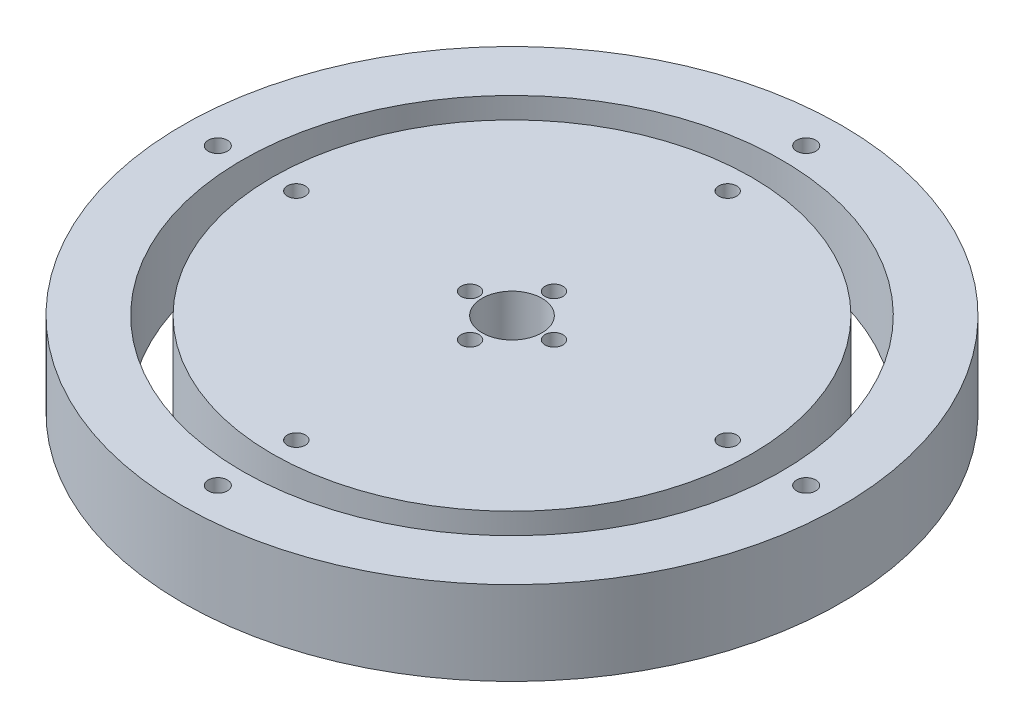
ISO-10303-21;
HEADER;
FILE_DESCRIPTION(('STEP AP214'),'2;1');
FILE_NAME('part.step','',(''),(''),'','','');
FILE_SCHEMA(('AUTOMOTIVE_DESIGN { 1 0 10303 214 1 1 1 1 }'));
ENDSEC;
DATA;
#1=APPLICATION_CONTEXT('core data for automotive mechanical design processes');
#2=APPLICATION_PROTOCOL_DEFINITION('international standard','automotive_design',2000,#1);
#3=PRODUCT_CONTEXT('',#1,'mechanical');
#4=PRODUCT('Part','Part','',(#3));
#5=PRODUCT_RELATED_PRODUCT_CATEGORY('part','',(#4));
#6=PRODUCT_DEFINITION_FORMATION('','',#4);
#7=PRODUCT_DEFINITION_CONTEXT('part definition',#1,'design');
#8=PRODUCT_DEFINITION('design','',#6,#7);
#9=PRODUCT_DEFINITION_SHAPE('','',#8);
#10=(LENGTH_UNIT() NAMED_UNIT(*) SI_UNIT(.MILLI.,.METRE.));
#11=(NAMED_UNIT(*) PLANE_ANGLE_UNIT() SI_UNIT($,.RADIAN.));
#12=(NAMED_UNIT(*) SI_UNIT($,.STERADIAN.) SOLID_ANGLE_UNIT());
#13=UNCERTAINTY_MEASURE_WITH_UNIT(LENGTH_MEASURE(1.E-05),#10,'distance_accuracy_value','');
#14=(GEOMETRIC_REPRESENTATION_CONTEXT(3) GLOBAL_UNCERTAINTY_ASSIGNED_CONTEXT((#13)) GLOBAL_UNIT_ASSIGNED_CONTEXT((#10,
#11,#12)) REPRESENTATION_CONTEXT('',''));
#15=CARTESIAN_POINT('',(0.,0.,0.));
#16=DIRECTION('',(0.,0.,1.));
#17=DIRECTION('',(1.,0.,0.));
#18=AXIS2_PLACEMENT_3D('',#15,#16,#17);
#19=CARTESIAN_POINT('',(0.,14.,0.));
#20=DIRECTION('',(0.,-1.,0.));
#21=DIRECTION('',(0.,0.,-1.));
#22=AXIS2_PLACEMENT_3D('',#19,#20,#21);
#23=CYLINDRICAL_SURFACE('',#22,5.);
#24=CARTESIAN_POINT('',(0.,14.,0.));
#25=DIRECTION('',(0.,1.,0.));
#26=DIRECTION('',(0.,0.,1.));
#27=AXIS2_PLACEMENT_3D('',#24,#25,#26);
#28=CIRCLE('',#27,5.);
#29=CARTESIAN_POINT('',(0.,14.,5.));
#30=VERTEX_POINT('',#29);
#31=EDGE_CURVE('E68',#30,#30,#28,.T.);
#32=ORIENTED_EDGE('',*,*,#31,.T.);
#33=EDGE_LOOP('',(#32));
#34=FACE_BOUND('',#33,.T.);
#35=CARTESIAN_POINT('',(0.,0.,0.));
#36=DIRECTION('',(0.,1.,0.));
#37=DIRECTION('',(0.,0.,1.));
#38=AXIS2_PLACEMENT_3D('',#35,#36,#37);
#39=CIRCLE('',#38,5.);
#40=CARTESIAN_POINT('',(0.,0.,5.));
#41=VERTEX_POINT('',#40);
#42=EDGE_CURVE('E109',#41,#41,#39,.T.);
#43=ORIENTED_EDGE('',*,*,#42,.F.);
#44=EDGE_LOOP('',(#43));
#45=FACE_BOUND('',#44,.T.);
#46=ADVANCED_FACE('F59',(#34,#45),#23,.F.);
#47=CARTESIAN_POINT('',(7.,14.,0.));
#48=DIRECTION('',(0.,-1.,0.));
#49=DIRECTION('',(0.,0.,-1.));
#50=AXIS2_PLACEMENT_3D('',#47,#48,#49);
#51=CYLINDRICAL_SURFACE('',#50,1.5);
#52=CARTESIAN_POINT('',(7.,14.,0.));
#53=DIRECTION('',(0.,1.,0.));
#54=DIRECTION('',(0.,0.,1.));
#55=AXIS2_PLACEMENT_3D('',#52,#53,#54);
#56=CIRCLE('',#55,1.5);
#57=CARTESIAN_POINT('',(7.,14.,1.5));
#58=VERTEX_POINT('',#57);
#59=EDGE_CURVE('E74',#58,#58,#56,.T.);
#60=ORIENTED_EDGE('',*,*,#59,.T.);
#61=EDGE_LOOP('',(#60));
#62=FACE_BOUND('',#61,.T.);
#63=CARTESIAN_POINT('',(7.,0.,0.));
#64=DIRECTION('',(0.,1.,0.));
#65=DIRECTION('',(0.,0.,1.));
#66=AXIS2_PLACEMENT_3D('',#63,#64,#65);
#67=CIRCLE('',#66,1.5);
#68=CARTESIAN_POINT('',(7.,0.,1.5));
#69=VERTEX_POINT('',#68);
#70=EDGE_CURVE('E106',#69,#69,#67,.T.);
#71=ORIENTED_EDGE('',*,*,#70,.F.);
#72=EDGE_LOOP('',(#71));
#73=FACE_BOUND('',#72,.T.);
#74=ADVANCED_FACE('F152',(#62,#73),#51,.F.);
#75=CARTESIAN_POINT('',(0.,14.,-7.));
#76=DIRECTION('',(0.,-1.,0.));
#77=DIRECTION('',(0.,0.,-1.));
#78=AXIS2_PLACEMENT_3D('',#75,#76,#77);
#79=CYLINDRICAL_SURFACE('',#78,1.5);
#80=CARTESIAN_POINT('',(0.,14.,-7.));
#81=DIRECTION('',(0.,1.,0.));
#82=DIRECTION('',(0.,0.,1.));
#83=AXIS2_PLACEMENT_3D('',#80,#81,#82);
#84=CIRCLE('',#83,1.5);
#85=CARTESIAN_POINT('',(0.,14.,-5.5));
#86=VERTEX_POINT('',#85);
#87=EDGE_CURVE('E145',#86,#86,#84,.T.);
#88=ORIENTED_EDGE('',*,*,#87,.T.);
#89=EDGE_LOOP('',(#88));
#90=FACE_BOUND('',#89,.T.);
#91=CARTESIAN_POINT('',(0.,0.,-7.));
#92=DIRECTION('',(0.,1.,0.));
#93=DIRECTION('',(0.,0.,1.));
#94=AXIS2_PLACEMENT_3D('',#91,#92,#93);
#95=CIRCLE('',#94,1.5);
#96=CARTESIAN_POINT('',(0.,0.,-5.5));
#97=VERTEX_POINT('',#96);
#98=EDGE_CURVE('E102',#97,#97,#95,.T.);
#99=ORIENTED_EDGE('',*,*,#98,.F.);
#100=EDGE_LOOP('',(#99));
#101=FACE_BOUND('',#100,.T.);
#102=ADVANCED_FACE('F170',(#90,#101),#79,.F.);
#103=CARTESIAN_POINT('',(-7.,14.,0.));
#104=DIRECTION('',(0.,-1.,0.));
#105=DIRECTION('',(0.,0.,-1.));
#106=AXIS2_PLACEMENT_3D('',#103,#104,#105);
#107=CYLINDRICAL_SURFACE('',#106,1.5);
#108=CARTESIAN_POINT('',(-7.,14.,0.));
#109=DIRECTION('',(0.,1.,0.));
#110=DIRECTION('',(0.,0.,1.));
#111=AXIS2_PLACEMENT_3D('',#108,#109,#110);
#112=CIRCLE('',#111,1.5);
#113=CARTESIAN_POINT('',(-7.,14.,1.5));
#114=VERTEX_POINT('',#113);
#115=EDGE_CURVE('E141',#114,#114,#112,.T.);
#116=ORIENTED_EDGE('',*,*,#115,.T.);
#117=EDGE_LOOP('',(#116));
#118=FACE_BOUND('',#117,.T.);
#119=CARTESIAN_POINT('',(-7.,0.,0.));
#120=DIRECTION('',(0.,1.,0.));
#121=DIRECTION('',(0.,0.,1.));
#122=AXIS2_PLACEMENT_3D('',#119,#120,#121);
#123=CIRCLE('',#122,1.5);
#124=CARTESIAN_POINT('',(-7.,0.,1.5));
#125=VERTEX_POINT('',#124);
#126=EDGE_CURVE('E98',#125,#125,#123,.T.);
#127=ORIENTED_EDGE('',*,*,#126,.F.);
#128=EDGE_LOOP('',(#127));
#129=FACE_BOUND('',#128,.T.);
#130=ADVANCED_FACE('F177',(#118,#129),#107,.F.);
#131=CARTESIAN_POINT('',(0.,14.,7.));
#132=DIRECTION('',(0.,-1.,0.));
#133=DIRECTION('',(0.,0.,-1.));
#134=AXIS2_PLACEMENT_3D('',#131,#132,#133);
#135=CYLINDRICAL_SURFACE('',#134,1.5);
#136=CARTESIAN_POINT('',(0.,14.,7.));
#137=DIRECTION('',(0.,1.,0.));
#138=DIRECTION('',(0.,0.,1.));
#139=AXIS2_PLACEMENT_3D('',#136,#137,#138);
#140=CIRCLE('',#139,1.5);
#141=CARTESIAN_POINT('',(0.,14.,8.5));
#142=VERTEX_POINT('',#141);
#143=EDGE_CURVE('E137',#142,#142,#140,.T.);
#144=ORIENTED_EDGE('',*,*,#143,.T.);
#145=EDGE_LOOP('',(#144));
#146=FACE_BOUND('',#145,.T.);
#147=CARTESIAN_POINT('',(0.,0.,7.));
#148=DIRECTION('',(0.,1.,0.));
#149=DIRECTION('',(0.,0.,1.));
#150=AXIS2_PLACEMENT_3D('',#147,#148,#149);
#151=CIRCLE('',#150,1.5);
#152=CARTESIAN_POINT('',(0.,0.,8.5));
#153=VERTEX_POINT('',#152);
#154=EDGE_CURVE('E94',#153,#153,#151,.T.);
#155=ORIENTED_EDGE('',*,*,#154,.F.);
#156=EDGE_LOOP('',(#155));
#157=FACE_BOUND('',#156,.T.);
#158=ADVANCED_FACE('F181',(#146,#157),#135,.F.);
#159=CARTESIAN_POINT('',(-36.,14.,0.));
#160=DIRECTION('',(0.,-1.,0.));
#161=DIRECTION('',(0.,0.,-1.));
#162=AXIS2_PLACEMENT_3D('',#159,#160,#161);
#163=CYLINDRICAL_SURFACE('',#162,1.5);
#164=CARTESIAN_POINT('',(-36.,14.,0.));
#165=DIRECTION('',(0.,1.,0.));
#166=DIRECTION('',(0.,0.,1.));
#167=AXIS2_PLACEMENT_3D('',#164,#165,#166);
#168=CIRCLE('',#167,1.5);
#169=CARTESIAN_POINT('',(-36.,14.,1.5));
#170=VERTEX_POINT('',#169);
#171=EDGE_CURVE('E133',#170,#170,#168,.T.);
#172=ORIENTED_EDGE('',*,*,#171,.T.);
#173=EDGE_LOOP('',(#172));
#174=FACE_BOUND('',#173,.T.);
#175=CARTESIAN_POINT('',(-36.,0.,0.));
#176=DIRECTION('',(0.,1.,0.));
#177=DIRECTION('',(0.,0.,1.));
#178=AXIS2_PLACEMENT_3D('',#175,#176,#177);
#179=CIRCLE('',#178,1.5);
#180=CARTESIAN_POINT('',(-36.,0.,1.5));
#181=VERTEX_POINT('',#180);
#182=EDGE_CURVE('E90',#181,#181,#179,.T.);
#183=ORIENTED_EDGE('',*,*,#182,.F.);
#184=EDGE_LOOP('',(#183));
#185=FACE_BOUND('',#184,.T.);
#186=ADVANCED_FACE('F185',(#174,#185),#163,.F.);
#187=CARTESIAN_POINT('',(36.,14.,0.));
#188=DIRECTION('',(0.,-1.,0.));
#189=DIRECTION('',(0.,0.,-1.));
#190=AXIS2_PLACEMENT_3D('',#187,#188,#189);
#191=CYLINDRICAL_SURFACE('',#190,1.5);
#192=CARTESIAN_POINT('',(36.,14.,0.));
#193=DIRECTION('',(0.,1.,0.));
#194=DIRECTION('',(0.,0.,1.));
#195=AXIS2_PLACEMENT_3D('',#192,#193,#194);
#196=CIRCLE('',#195,1.5);
#197=CARTESIAN_POINT('',(36.,14.,1.5));
#198=VERTEX_POINT('',#197);
#199=EDGE_CURVE('E127',#198,#198,#196,.T.);
#200=ORIENTED_EDGE('',*,*,#199,.T.);
#201=EDGE_LOOP('',(#200));
#202=FACE_BOUND('',#201,.T.);
#203=CARTESIAN_POINT('',(36.,0.,0.));
#204=DIRECTION('',(0.,1.,0.));
#205=DIRECTION('',(0.,0.,1.));
#206=AXIS2_PLACEMENT_3D('',#203,#204,#205);
#207=CIRCLE('',#206,1.5);
#208=CARTESIAN_POINT('',(36.,0.,1.5));
#209=VERTEX_POINT('',#208);
#210=EDGE_CURVE('E86',#209,#209,#207,.T.);
#211=ORIENTED_EDGE('',*,*,#210,.F.);
#212=EDGE_LOOP('',(#211));
#213=FACE_BOUND('',#212,.T.);
#214=ADVANCED_FACE('F189',(#202,#213),#191,.F.);
#215=CARTESIAN_POINT('',(0.,14.,-36.));
#216=DIRECTION('',(0.,-1.,0.));
#217=DIRECTION('',(0.,0.,-1.));
#218=AXIS2_PLACEMENT_3D('',#215,#216,#217);
#219=CYLINDRICAL_SURFACE('',#218,1.5);
#220=CARTESIAN_POINT('',(0.,14.,-36.));
#221=DIRECTION('',(0.,1.,0.));
#222=DIRECTION('',(0.,0.,1.));
#223=AXIS2_PLACEMENT_3D('',#220,#221,#222);
#224=CIRCLE('',#223,1.5);
#225=CARTESIAN_POINT('',(0.,14.,-34.5));
#226=VERTEX_POINT('',#225);
#227=EDGE_CURVE('E121',#226,#226,#224,.T.);
#228=ORIENTED_EDGE('',*,*,#227,.T.);
#229=EDGE_LOOP('',(#228));
#230=FACE_BOUND('',#229,.T.);
#231=CARTESIAN_POINT('',(0.,0.,-36.));
#232=DIRECTION('',(0.,1.,0.));
#233=DIRECTION('',(0.,0.,1.));
#234=AXIS2_PLACEMENT_3D('',#231,#232,#233);
#235=CIRCLE('',#234,1.5);
#236=CARTESIAN_POINT('',(0.,0.,-34.5));
#237=VERTEX_POINT('',#236);
#238=EDGE_CURVE('E82',#237,#237,#235,.T.);
#239=ORIENTED_EDGE('',*,*,#238,.F.);
#240=EDGE_LOOP('',(#239));
#241=FACE_BOUND('',#240,.T.);
#242=ADVANCED_FACE('F192',(#230,#241),#219,.F.);
#243=CARTESIAN_POINT('',(0.,14.,36.));
#244=DIRECTION('',(0.,-1.,0.));
#245=DIRECTION('',(0.,0.,-1.));
#246=AXIS2_PLACEMENT_3D('',#243,#244,#245);
#247=CYLINDRICAL_SURFACE('',#246,1.5);
#248=CARTESIAN_POINT('',(0.,14.,36.));
#249=DIRECTION('',(0.,1.,0.));
#250=DIRECTION('',(0.,0.,1.));
#251=AXIS2_PLACEMENT_3D('',#248,#249,#250);
#252=CIRCLE('',#251,1.5);
#253=CARTESIAN_POINT('',(0.,14.,37.5));
#254=VERTEX_POINT('',#253);
#255=EDGE_CURVE('E116',#254,#254,#252,.T.);
#256=ORIENTED_EDGE('',*,*,#255,.T.);
#257=EDGE_LOOP('',(#256));
#258=FACE_BOUND('',#257,.T.);
#259=CARTESIAN_POINT('',(0.,0.,36.));
#260=DIRECTION('',(0.,1.,0.));
#261=DIRECTION('',(0.,0.,1.));
#262=AXIS2_PLACEMENT_3D('',#259,#260,#261);
#263=CIRCLE('',#262,1.5);
#264=CARTESIAN_POINT('',(0.,0.,37.5));
#265=VERTEX_POINT('',#264);
#266=EDGE_CURVE('E78',#265,#265,#263,.T.);
#267=ORIENTED_EDGE('',*,*,#266,.F.);
#268=EDGE_LOOP('',(#267));
#269=FACE_BOUND('',#268,.T.);
#270=ADVANCED_FACE('F61',(#258,#269),#247,.F.);
#271=CARTESIAN_POINT('',(0.,14.,0.));
#272=DIRECTION('',(0.,-1.,0.));
#273=DIRECTION('',(0.,0.,-1.));
#274=AXIS2_PLACEMENT_3D('',#271,#272,#273);
#275=CYLINDRICAL_SURFACE('',#274,40.);
#276=CARTESIAN_POINT('',(0.,14.,0.));
#277=DIRECTION('',(0.,1.,0.));
#278=DIRECTION('',(0.,0.,1.));
#279=AXIS2_PLACEMENT_3D('',#276,#277,#278);
#280=CIRCLE('',#279,40.);
#281=CARTESIAN_POINT('',(0.,14.,40.));
#282=VERTEX_POINT('',#281);
#283=EDGE_CURVE('E12',#282,#282,#280,.T.);
#284=ORIENTED_EDGE('',*,*,#283,.F.);
#285=EDGE_LOOP('',(#284));
#286=FACE_BOUND('',#285,.T.);
#287=CARTESIAN_POINT('',(0.,0.,0.));
#288=DIRECTION('',(0.,1.,0.));
#289=DIRECTION('',(0.,0.,1.));
#290=AXIS2_PLACEMENT_3D('',#287,#288,#289);
#291=CIRCLE('',#290,40.);
#292=CARTESIAN_POINT('',(0.,0.,40.));
#293=VERTEX_POINT('',#292);
#294=EDGE_CURVE('E63',#293,#293,#291,.T.);
#295=ORIENTED_EDGE('',*,*,#294,.T.);
#296=EDGE_LOOP('',(#295));
#297=FACE_BOUND('',#296,.T.);
#298=ADVANCED_FACE('F159',(#286,#297),#275,.T.);
#299=CARTESIAN_POINT('',(0.,14.,0.));
#300=DIRECTION('',(0.,1.,0.));
#301=DIRECTION('',(0.,0.,1.));
#302=AXIS2_PLACEMENT_3D('',#299,#300,#301);
#303=PLANE('',#302);
#304=ORIENTED_EDGE('',*,*,#255,.F.);
#305=EDGE_LOOP('',(#304));
#306=FACE_BOUND('',#305,.T.);
#307=ORIENTED_EDGE('',*,*,#227,.F.);
#308=EDGE_LOOP('',(#307));
#309=FACE_BOUND('',#308,.T.);
#310=ORIENTED_EDGE('',*,*,#199,.F.);
#311=EDGE_LOOP('',(#310));
#312=FACE_BOUND('',#311,.T.);
#313=ORIENTED_EDGE('',*,*,#171,.F.);
#314=EDGE_LOOP('',(#313));
#315=FACE_BOUND('',#314,.T.);
#316=ORIENTED_EDGE('',*,*,#143,.F.);
#317=EDGE_LOOP('',(#316));
#318=FACE_BOUND('',#317,.T.);
#319=ORIENTED_EDGE('',*,*,#115,.F.);
#320=EDGE_LOOP('',(#319));
#321=FACE_BOUND('',#320,.T.);
#322=ORIENTED_EDGE('',*,*,#87,.F.);
#323=EDGE_LOOP('',(#322));
#324=FACE_BOUND('',#323,.T.);
#325=ORIENTED_EDGE('',*,*,#59,.F.);
#326=EDGE_LOOP('',(#325));
#327=FACE_BOUND('',#326,.T.);
#328=ORIENTED_EDGE('',*,*,#31,.F.);
#329=EDGE_LOOP('',(#328));
#330=FACE_BOUND('',#329,.T.);
#331=ORIENTED_EDGE('',*,*,#283,.T.);
#332=EDGE_LOOP('',(#331));
#333=FACE_BOUND('',#332,.T.);
#334=ADVANCED_FACE('F155',(#306,#309,#312,#315,#318,#321,#324,#327,#330,#333),#303,.T.);
#335=CARTESIAN_POINT('',(0.,0.,0.));
#336=DIRECTION('',(0.,1.,0.));
#337=DIRECTION('',(0.,0.,1.));
#338=AXIS2_PLACEMENT_3D('',#335,#336,#337);
#339=PLANE('',#338);
#340=ORIENTED_EDGE('',*,*,#266,.T.);
#341=EDGE_LOOP('',(#340));
#342=FACE_BOUND('',#341,.T.);
#343=ORIENTED_EDGE('',*,*,#238,.T.);
#344=EDGE_LOOP('',(#343));
#345=FACE_BOUND('',#344,.T.);
#346=ORIENTED_EDGE('',*,*,#210,.T.);
#347=EDGE_LOOP('',(#346));
#348=FACE_BOUND('',#347,.T.);
#349=ORIENTED_EDGE('',*,*,#182,.T.);
#350=EDGE_LOOP('',(#349));
#351=FACE_BOUND('',#350,.T.);
#352=ORIENTED_EDGE('',*,*,#154,.T.);
#353=EDGE_LOOP('',(#352));
#354=FACE_BOUND('',#353,.T.);
#355=ORIENTED_EDGE('',*,*,#126,.T.);
#356=EDGE_LOOP('',(#355));
#357=FACE_BOUND('',#356,.T.);
#358=ORIENTED_EDGE('',*,*,#98,.T.);
#359=EDGE_LOOP('',(#358));
#360=FACE_BOUND('',#359,.T.);
#361=ORIENTED_EDGE('',*,*,#70,.T.);
#362=EDGE_LOOP('',(#361));
#363=FACE_BOUND('',#362,.T.);
#364=ORIENTED_EDGE('',*,*,#42,.T.);
#365=EDGE_LOOP('',(#364));
#366=FACE_BOUND('',#365,.T.);
#367=ORIENTED_EDGE('',*,*,#294,.F.);
#368=EDGE_LOOP('',(#367));
#369=FACE_BOUND('',#368,.T.);
#370=ADVANCED_FACE('F158',(#342,#345,#348,#351,#354,#357,#360,#363,#366,#369),#339,.F.);
#371=CLOSED_SHELL('',(#46,#74,#102,#130,#158,#186,#214,#242,#270,#298,#334,#370));
#372=MANIFOLD_SOLID_BREP('B2',#371);
#373=CARTESIAN_POINT('',(0.,14.,0.));
#374=DIRECTION('',(0.,-1.,0.));
#375=DIRECTION('',(0.,0.,-1.));
#376=AXIS2_PLACEMENT_3D('',#373,#374,#375);
#377=CYLINDRICAL_SURFACE('',#376,45.);
#378=CARTESIAN_POINT('',(0.,14.,0.));
#379=DIRECTION('',(0.,1.,0.));
#380=DIRECTION('',(0.,0.,1.));
#381=AXIS2_PLACEMENT_3D('',#378,#379,#380);
#382=CIRCLE('',#381,45.);
#383=CARTESIAN_POINT('',(0.,14.,45.));
#384=VERTEX_POINT('',#383);
#385=EDGE_CURVE('E317',#384,#384,#382,.T.);
#386=ORIENTED_EDGE('',*,*,#385,.T.);
#387=EDGE_LOOP('',(#386));
#388=FACE_BOUND('',#387,.T.);
#389=CARTESIAN_POINT('',(0.,0.,0.));
#390=DIRECTION('',(0.,1.,0.));
#391=DIRECTION('',(0.,0.,1.));
#392=AXIS2_PLACEMENT_3D('',#389,#390,#391);
#393=CIRCLE('',#392,45.);
#394=CARTESIAN_POINT('',(0.,0.,45.));
#395=VERTEX_POINT('',#394);
#396=EDGE_CURVE('E337',#395,#395,#393,.T.);
#397=ORIENTED_EDGE('',*,*,#396,.F.);
#398=EDGE_LOOP('',(#397));
#399=FACE_BOUND('',#398,.T.);
#400=ADVANCED_FACE('F309',(#388,#399),#377,.F.);
#401=CARTESIAN_POINT('',(-49.1,14.,0.));
#402=DIRECTION('',(0.,-1.,0.));
#403=DIRECTION('',(0.,0.,-1.));
#404=AXIS2_PLACEMENT_3D('',#401,#402,#403);
#405=CYLINDRICAL_SURFACE('',#404,1.60000000000001);
#406=CARTESIAN_POINT('',(-49.1,14.,0.));
#407=DIRECTION('',(0.,1.,0.));
#408=DIRECTION('',(0.,0.,1.));
#409=AXIS2_PLACEMENT_3D('',#406,#407,#408);
#410=CIRCLE('',#409,1.60000000000001);
#411=CARTESIAN_POINT('',(-49.1,14.,1.60000000000001));
#412=VERTEX_POINT('',#411);
#413=EDGE_CURVE('E322',#412,#412,#410,.T.);
#414=ORIENTED_EDGE('',*,*,#413,.T.);
#415=EDGE_LOOP('',(#414));
#416=FACE_BOUND('',#415,.T.);
#417=CARTESIAN_POINT('',(-49.1,0.,0.));
#418=DIRECTION('',(0.,1.,0.));
#419=DIRECTION('',(0.,0.,1.));
#420=AXIS2_PLACEMENT_3D('',#417,#418,#419);
#421=CIRCLE('',#420,1.60000000000001);
#422=CARTESIAN_POINT('',(-49.1,0.,1.60000000000001));
#423=VERTEX_POINT('',#422);
#424=EDGE_CURVE('E335',#423,#423,#421,.T.);
#425=ORIENTED_EDGE('',*,*,#424,.F.);
#426=EDGE_LOOP('',(#425));
#427=FACE_BOUND('',#426,.T.);
#428=ADVANCED_FACE('F358',(#416,#427),#405,.F.);
#429=CARTESIAN_POINT('',(49.1,14.,0.));
#430=DIRECTION('',(0.,-1.,0.));
#431=DIRECTION('',(0.,0.,-1.));
#432=AXIS2_PLACEMENT_3D('',#429,#430,#431);
#433=CYLINDRICAL_SURFACE('',#432,1.60000000000001);
#434=CARTESIAN_POINT('',(49.1,14.,0.));
#435=DIRECTION('',(0.,1.,0.));
#436=DIRECTION('',(0.,0.,1.));
#437=AXIS2_PLACEMENT_3D('',#434,#435,#436);
#438=CIRCLE('',#437,1.60000000000001);
#439=CARTESIAN_POINT('',(49.1,14.,1.60000000000001));
#440=VERTEX_POINT('',#439);
#441=EDGE_CURVE('E351',#440,#440,#438,.T.);
#442=ORIENTED_EDGE('',*,*,#441,.T.);
#443=EDGE_LOOP('',(#442));
#444=FACE_BOUND('',#443,.T.);
#445=CARTESIAN_POINT('',(49.1,0.,0.));
#446=DIRECTION('',(0.,1.,0.));
#447=DIRECTION('',(0.,0.,1.));
#448=AXIS2_PLACEMENT_3D('',#445,#446,#447);
#449=CIRCLE('',#448,1.60000000000001);
#450=CARTESIAN_POINT('',(49.1,0.,1.60000000000001));
#451=VERTEX_POINT('',#450);
#452=EDGE_CURVE('E332',#451,#451,#449,.T.);
#453=ORIENTED_EDGE('',*,*,#452,.F.);
#454=EDGE_LOOP('',(#453));
#455=FACE_BOUND('',#454,.T.);
#456=ADVANCED_FACE('F376',(#444,#455),#433,.F.);
#457=CARTESIAN_POINT('',(0.,14.,-49.1));
#458=DIRECTION('',(0.,-1.,0.));
#459=DIRECTION('',(0.,0.,-1.));
#460=AXIS2_PLACEMENT_3D('',#457,#458,#459);
#461=CYLINDRICAL_SURFACE('',#460,1.6);
#462=CARTESIAN_POINT('',(0.,14.,-49.1));
#463=DIRECTION('',(0.,1.,0.));
#464=DIRECTION('',(0.,0.,1.));
#465=AXIS2_PLACEMENT_3D('',#462,#463,#464);
#466=CIRCLE('',#465,1.6);
#467=CARTESIAN_POINT('',(0.,14.,-47.5));
#468=VERTEX_POINT('',#467);
#469=EDGE_CURVE('E346',#468,#468,#466,.T.);
#470=ORIENTED_EDGE('',*,*,#469,.T.);
#471=EDGE_LOOP('',(#470));
#472=FACE_BOUND('',#471,.T.);
#473=CARTESIAN_POINT('',(0.,0.,-49.1));
#474=DIRECTION('',(0.,1.,0.));
#475=DIRECTION('',(0.,0.,1.));
#476=AXIS2_PLACEMENT_3D('',#473,#474,#475);
#477=CIRCLE('',#476,1.6);
#478=CARTESIAN_POINT('',(0.,0.,-47.5));
#479=VERTEX_POINT('',#478);
#480=EDGE_CURVE('E329',#479,#479,#477,.T.);
#481=ORIENTED_EDGE('',*,*,#480,.F.);
#482=EDGE_LOOP('',(#481));
#483=FACE_BOUND('',#482,.T.);
#484=ADVANCED_FACE('F382',(#472,#483),#461,.F.);
#485=CARTESIAN_POINT('',(0.,14.,49.1));
#486=DIRECTION('',(0.,-1.,0.));
#487=DIRECTION('',(0.,0.,-1.));
#488=AXIS2_PLACEMENT_3D('',#485,#486,#487);
#489=CYLINDRICAL_SURFACE('',#488,1.6);
#490=CARTESIAN_POINT('',(0.,14.,49.1));
#491=DIRECTION('',(0.,1.,0.));
#492=DIRECTION('',(0.,0.,1.));
#493=AXIS2_PLACEMENT_3D('',#490,#491,#492);
#494=CIRCLE('',#493,1.6);
#495=CARTESIAN_POINT('',(0.,14.,50.7));
#496=VERTEX_POINT('',#495);
#497=EDGE_CURVE('E342',#496,#496,#494,.T.);
#498=ORIENTED_EDGE('',*,*,#497,.T.);
#499=EDGE_LOOP('',(#498));
#500=FACE_BOUND('',#499,.T.);
#501=CARTESIAN_POINT('',(0.,0.,49.1));
#502=DIRECTION('',(0.,1.,0.));
#503=DIRECTION('',(0.,0.,1.));
#504=AXIS2_PLACEMENT_3D('',#501,#502,#503);
#505=CIRCLE('',#504,1.6);
#506=CARTESIAN_POINT('',(0.,0.,50.7));
#507=VERTEX_POINT('',#506);
#508=EDGE_CURVE('E326',#507,#507,#505,.T.);
#509=ORIENTED_EDGE('',*,*,#508,.F.);
#510=EDGE_LOOP('',(#509));
#511=FACE_BOUND('',#510,.T.);
#512=ADVANCED_FACE('F311',(#500,#511),#489,.F.);
#513=CARTESIAN_POINT('',(0.,14.,0.));
#514=DIRECTION('',(0.,-1.,0.));
#515=DIRECTION('',(0.,0.,-1.));
#516=AXIS2_PLACEMENT_3D('',#513,#514,#515);
#517=CYLINDRICAL_SURFACE('',#516,55.);
#518=CARTESIAN_POINT('',(0.,14.,0.));
#519=DIRECTION('',(0.,1.,0.));
#520=DIRECTION('',(0.,0.,1.));
#521=AXIS2_PLACEMENT_3D('',#518,#519,#520);
#522=CIRCLE('',#521,55.);
#523=CARTESIAN_POINT('',(0.,14.,55.));
#524=VERTEX_POINT('',#523);
#525=EDGE_CURVE('E58',#524,#524,#522,.T.);
#526=ORIENTED_EDGE('',*,*,#525,.F.);
#527=EDGE_LOOP('',(#526));
#528=FACE_BOUND('',#527,.T.);
#529=CARTESIAN_POINT('',(0.,0.,0.));
#530=DIRECTION('',(0.,1.,0.));
#531=DIRECTION('',(0.,0.,1.));
#532=AXIS2_PLACEMENT_3D('',#529,#530,#531);
#533=CIRCLE('',#532,55.);
#534=CARTESIAN_POINT('',(0.,0.,55.));
#535=VERTEX_POINT('',#534);
#536=EDGE_CURVE('E313',#535,#535,#533,.T.);
#537=ORIENTED_EDGE('',*,*,#536,.T.);
#538=EDGE_LOOP('',(#537));
#539=FACE_BOUND('',#538,.T.);
#540=ADVANCED_FACE('F365',(#528,#539),#517,.T.);
#541=CARTESIAN_POINT('',(0.,14.,0.));
#542=DIRECTION('',(0.,1.,0.));
#543=DIRECTION('',(0.,0.,1.));
#544=AXIS2_PLACEMENT_3D('',#541,#542,#543);
#545=PLANE('',#544);
#546=ORIENTED_EDGE('',*,*,#497,.F.);
#547=EDGE_LOOP('',(#546));
#548=FACE_BOUND('',#547,.T.);
#549=ORIENTED_EDGE('',*,*,#469,.F.);
#550=EDGE_LOOP('',(#549));
#551=FACE_BOUND('',#550,.T.);
#552=ORIENTED_EDGE('',*,*,#441,.F.);
#553=EDGE_LOOP('',(#552));
#554=FACE_BOUND('',#553,.T.);
#555=ORIENTED_EDGE('',*,*,#413,.F.);
#556=EDGE_LOOP('',(#555));
#557=FACE_BOUND('',#556,.T.);
#558=ORIENTED_EDGE('',*,*,#385,.F.);
#559=EDGE_LOOP('',(#558));
#560=FACE_BOUND('',#559,.T.);
#561=ORIENTED_EDGE('',*,*,#525,.T.);
#562=EDGE_LOOP('',(#561));
#563=FACE_BOUND('',#562,.T.);
#564=ADVANCED_FACE('F361',(#548,#551,#554,#557,#560,#563),#545,.T.);
#565=CARTESIAN_POINT('',(0.,0.,0.));
#566=DIRECTION('',(0.,1.,0.));
#567=DIRECTION('',(0.,0.,1.));
#568=AXIS2_PLACEMENT_3D('',#565,#566,#567);
#569=PLANE('',#568);
#570=ORIENTED_EDGE('',*,*,#508,.T.);
#571=EDGE_LOOP('',(#570));
#572=FACE_BOUND('',#571,.T.);
#573=ORIENTED_EDGE('',*,*,#480,.T.);
#574=EDGE_LOOP('',(#573));
#575=FACE_BOUND('',#574,.T.);
#576=ORIENTED_EDGE('',*,*,#452,.T.);
#577=EDGE_LOOP('',(#576));
#578=FACE_BOUND('',#577,.T.);
#579=ORIENTED_EDGE('',*,*,#424,.T.);
#580=EDGE_LOOP('',(#579));
#581=FACE_BOUND('',#580,.T.);
#582=ORIENTED_EDGE('',*,*,#396,.T.);
#583=EDGE_LOOP('',(#582));
#584=FACE_BOUND('',#583,.T.);
#585=ORIENTED_EDGE('',*,*,#536,.F.);
#586=EDGE_LOOP('',(#585));
#587=FACE_BOUND('',#586,.T.);
#588=ADVANCED_FACE('F364',(#572,#575,#578,#581,#584,#587),#569,.F.);
#589=CLOSED_SHELL('',(#400,#428,#456,#484,#512,#540,#564,#588));
#590=MANIFOLD_SOLID_BREP('B7',#589);
#591=ADVANCED_BREP_SHAPE_REPRESENTATION('',(#18,#372,#590),#14);
#592=SHAPE_DEFINITION_REPRESENTATION(#9,#591);
ENDSEC;
END-ISO-10303-21;
